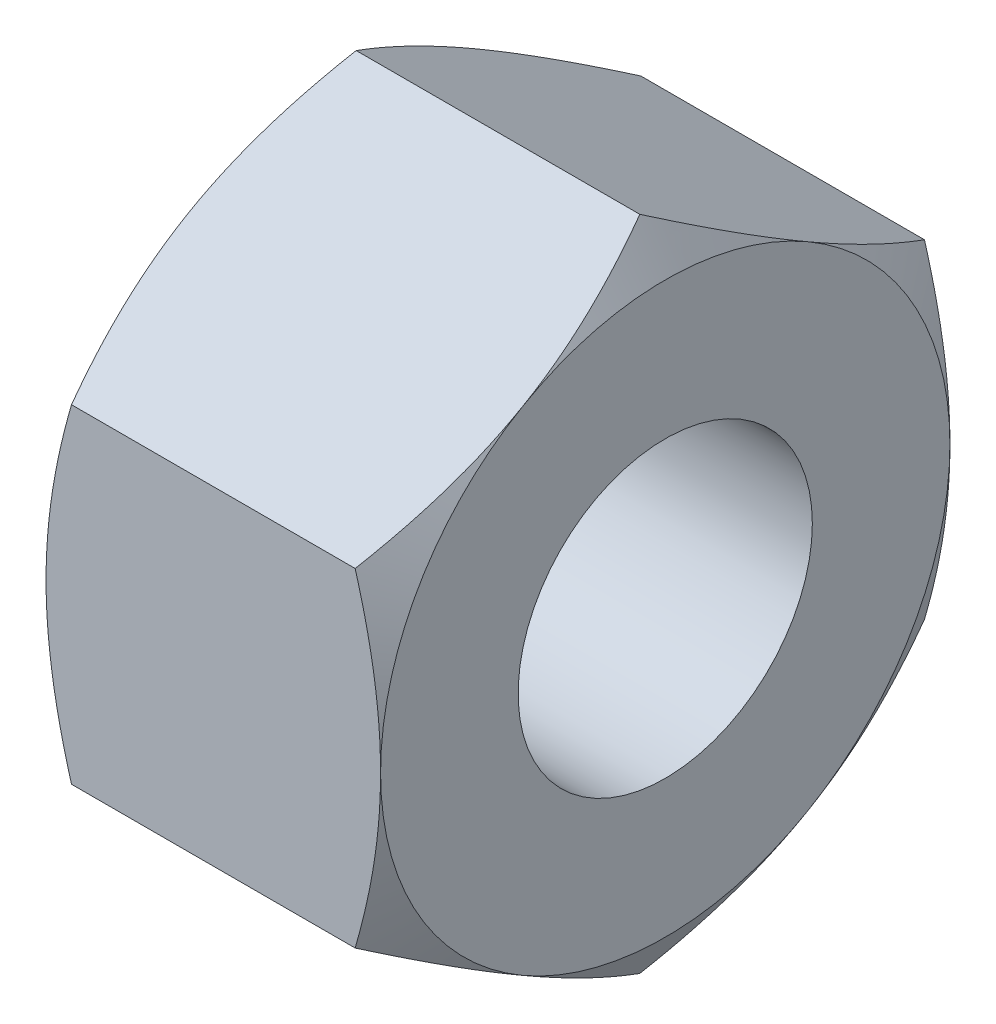
ISO-10303-21;
HEADER;
FILE_DESCRIPTION(('STEP AP214'),'2;1');
FILE_NAME('part.step','',(''),(''),'','','');
FILE_SCHEMA(('AUTOMOTIVE_DESIGN { 1 0 10303 214 1 1 1 1 }'));
ENDSEC;
DATA;
#1=APPLICATION_CONTEXT('core data for automotive mechanical design processes');
#2=APPLICATION_PROTOCOL_DEFINITION('international standard','automotive_design',2000,#1);
#3=PRODUCT_CONTEXT('',#1,'mechanical');
#4=PRODUCT('Part','Part','',(#3));
#5=PRODUCT_RELATED_PRODUCT_CATEGORY('part','',(#4));
#6=PRODUCT_DEFINITION_FORMATION('','',#4);
#7=PRODUCT_DEFINITION_CONTEXT('part definition',#1,'design');
#8=PRODUCT_DEFINITION('design','',#6,#7);
#9=PRODUCT_DEFINITION_SHAPE('','',#8);
#10=(LENGTH_UNIT() NAMED_UNIT(*) SI_UNIT(.MILLI.,.METRE.));
#11=(NAMED_UNIT(*) PLANE_ANGLE_UNIT() SI_UNIT($,.RADIAN.));
#12=(NAMED_UNIT(*) SI_UNIT($,.STERADIAN.) SOLID_ANGLE_UNIT());
#13=UNCERTAINTY_MEASURE_WITH_UNIT(LENGTH_MEASURE(1.E-05),#10,'distance_accuracy_value','');
#14=(GEOMETRIC_REPRESENTATION_CONTEXT(3) GLOBAL_UNCERTAINTY_ASSIGNED_CONTEXT((#13)) GLOBAL_UNIT_ASSIGNED_CONTEXT((#10,
#11,#12)) REPRESENTATION_CONTEXT('',''));
#15=CARTESIAN_POINT('',(0.,0.,0.));
#16=DIRECTION('',(0.,0.,1.));
#17=DIRECTION('',(1.,0.,0.));
#18=AXIS2_PLACEMENT_3D('',#15,#16,#17);
#19=CARTESIAN_POINT('',(-4.7,2.30940107675851,-4.));
#20=DIRECTION('',(0.,0.866025403784439,-0.5));
#21=DIRECTION('',(0.,0.5,0.866025403784439));
#22=AXIS2_PLACEMENT_3D('',#19,#20,#21);
#23=PLANE('',#22);
#24=DIRECTION('',(1.,0.,0.));
#25=VECTOR('',#24,1.);
#26=CARTESIAN_POINT('',(-4.7,2.30940107675851,-4.));
#27=LINE('',#26,#25);
#28=CARTESIAN_POINT('',(-4.34273441009184,2.30940107675851,-4.));
#29=VERTEX_POINT('',#28);
#30=CARTESIAN_POINT('',(-0.357265589908162,2.30940107675851,-4.));
#31=VERTEX_POINT('',#30);
#32=EDGE_CURVE('E246',#29,#31,#27,.T.);
#33=ORIENTED_EDGE('',*,*,#32,.F.);
#34=CARTESIAN_POINT('',(-4.34266774092523,2.30928560670467,-4.0002));
#35=CARTESIAN_POINT('',(-4.40128212635172,2.41077174646171,-3.82442084967677));
#36=CARTESIAN_POINT('',(-4.45458967853774,2.513133908835,-3.64712438367362));
#37=CARTESIAN_POINT('',(-4.5476383292536,2.71963072479812,-3.28946140682429));
#38=CARTESIAN_POINT('',(-4.5873465109703,2.82376904741904,-3.10908854102985));
#39=CARTESIAN_POINT('',(-4.64915778471972,3.03075510011795,-2.75057818129721));
#40=CARTESIAN_POINT('',(-4.67167226847711,3.13357098372492,-2.57249584706486));
#41=CARTESIAN_POINT('',(-4.69854937685342,3.33968651028529,-2.21549328283349));
#42=CARTESIAN_POINT('',(-4.70293425857306,3.44298540411434,-2.0365743503559));
#43=CARTESIAN_POINT('',(-4.69380992706003,3.63600352522933,-1.70225715780327));
#44=CARTESIAN_POINT('',(-4.68254104601201,3.72575165335065,-1.54680884001293));
#45=CARTESIAN_POINT('',(-4.64682600920181,3.90466320392055,-1.23692494436494));
#46=CARTESIAN_POINT('',(-4.62236765428847,3.99382600759479,-1.08249043825587));
#47=CARTESIAN_POINT('',(-4.56122393508071,4.17310641015197,-0.771967672225421));
#48=CARTESIAN_POINT('',(-4.52427939634514,4.26320131938131,-0.615918711936898));
#49=CARTESIAN_POINT('',(-4.44042992745197,4.44204742827551,-0.306148164596161));
#50=CARTESIAN_POINT('',(-4.39354469778726,4.53080091904966,-0.152422609226222));
#51=CARTESIAN_POINT('',(-4.34266774092523,4.61891762357085,0.0001999999999992));
#52=B_SPLINE_CURVE_WITH_KNOTS('',3,(#34,#35,#36,#37,#38,#39,#40,#41,#42,#43,#44,#45,#46,#47,#48,
#49,#50,#51),.UNSPECIFIED.,.F.,.F.,(4,2,2,2,2,2,2,2,4),(0.,0.634047835695966,1.26961969224543,
1.88946157213122,2.50854226669297,3.04757825393386,3.58711366126903,4.13861653143764,
4.68903648037743),.UNSPECIFIED.);
#53=CARTESIAN_POINT('',(-4.7,3.46410161513775,-2.));
#54=VERTEX_POINT('',#53);
#55=EDGE_CURVE('E133',#29,#54,#52,.T.);
#56=ORIENTED_EDGE('',*,*,#55,.T.);
#57=CARTESIAN_POINT('',(-4.34273441009184,4.61880215351701,0.));
#58=VERTEX_POINT('',#57);
#59=EDGE_CURVE('E54',#54,#58,#52,.T.);
#60=ORIENTED_EDGE('',*,*,#59,.T.);
#61=DIRECTION('',(1.,0.,0.));
#62=VECTOR('',#61,1.);
#63=CARTESIAN_POINT('',(-4.7,4.61880215351701,0.));
#64=LINE('',#63,#62);
#65=CARTESIAN_POINT('',(-0.357265589908163,4.61880215351701,0.));
#66=VERTEX_POINT('',#65);
#67=EDGE_CURVE('E286',#58,#66,#64,.T.);
#68=ORIENTED_EDGE('',*,*,#67,.T.);
#69=CARTESIAN_POINT('',(-0.357332259074767,4.61891762357085,0.000199999999999147));
#70=CARTESIAN_POINT('',(-0.298717873648283,4.51743148381381,-0.175579150323229));
#71=CARTESIAN_POINT('',(-0.245410321462263,4.41506932144052,-0.352875616326382));
#72=CARTESIAN_POINT('',(-0.152361670746404,4.2085725054774,-0.710538593175708));
#73=CARTESIAN_POINT('',(-0.112653489029704,4.10443418285647,-0.890911458970153));
#74=CARTESIAN_POINT('',(-0.0508422152802794,3.89744813015756,-1.24942181870279));
#75=CARTESIAN_POINT('',(-0.0283277315228897,3.79463224655059,-1.42750415293514));
#76=CARTESIAN_POINT('',(-0.00145062314658286,3.58851671999023,-1.78450671716651));
#77=CARTESIAN_POINT('',(0.00293425857305602,3.48521782616117,-1.9634256496441));
#78=CARTESIAN_POINT('',(-0.00619007293997078,3.29219970504619,-2.29774284219673));
#79=CARTESIAN_POINT('',(-0.0174589539879948,3.20245157692486,-2.45319115998707));
#80=CARTESIAN_POINT('',(-0.0531739907981936,3.02354002635497,-2.76307505563506));
#81=CARTESIAN_POINT('',(-0.0776323457115334,2.93437722268073,-2.91750956174413));
#82=CARTESIAN_POINT('',(-0.13877606491929,2.75509682012354,-3.22803232777458));
#83=CARTESIAN_POINT('',(-0.175720603654864,2.6650019108942,-3.3840812880631));
#84=CARTESIAN_POINT('',(-0.259570072548027,2.48615580200001,-3.69385183540384));
#85=CARTESIAN_POINT('',(-0.30645530221274,2.39740231122585,-3.84757739077378));
#86=CARTESIAN_POINT('',(-0.357332259074766,2.30928560670467,-4.0002));
#87=B_SPLINE_CURVE_WITH_KNOTS('',3,(#69,#70,#71,#72,#73,#74,#75,#76,#77,#78,#79,#80,#81,#82,#83,
#84,#85,#86),.UNSPECIFIED.,.F.,.F.,(4,2,2,2,2,2,2,2,4),(0.,0.634047835695967,1.26961969224543,
1.88946157213122,2.50854226669297,3.04757825393386,3.58711366126903,4.13861653143764,
4.68903648037743),.UNSPECIFIED.);
#88=CARTESIAN_POINT('',(0.,3.46410161513775,-2.));
#89=VERTEX_POINT('',#88);
#90=EDGE_CURVE('E280',#66,#89,#87,.T.);
#91=ORIENTED_EDGE('',*,*,#90,.T.);
#92=EDGE_CURVE('E263',#89,#31,#87,.T.);
#93=ORIENTED_EDGE('',*,*,#92,.T.);
#94=EDGE_LOOP('',(#33,#56,#60,#68,#91,#93));
#95=FACE_BOUND('',#94,.T.);
#96=ADVANCED_FACE('F38',(#95),#23,.T.);
#97=CARTESIAN_POINT('',(-4.7,-2.3094010767585,-4.));
#98=DIRECTION('',(0.,0.,-1.));
#99=DIRECTION('',(0.,1.,0.));
#100=AXIS2_PLACEMENT_3D('',#97,#98,#99);
#101=PLANE('',#100);
#102=DIRECTION('',(1.,0.,0.));
#103=VECTOR('',#102,1.);
#104=CARTESIAN_POINT('',(-4.7,-2.3094010767585,-4.));
#105=LINE('',#104,#103);
#106=CARTESIAN_POINT('',(-4.34273441009218,-2.30940107675901,-4.));
#107=VERTEX_POINT('',#106);
#108=CARTESIAN_POINT('',(-0.357265589908161,-2.3094010767585,-4.));
#109=VERTEX_POINT('',#108);
#110=EDGE_CURVE('E156',#107,#109,#105,.T.);
#111=ORIENTED_EDGE('',*,*,#110,.F.);
#112=CARTESIAN_POINT('',(-2.73915863045049,-6.22132716152689,-4.));
#113=CARTESIAN_POINT('',(-2.82407869444724,-6.04641542373816,-4.));
#114=CARTESIAN_POINT('',(-2.90818948420925,-5.87110397724771,-4.));
#115=CARTESIAN_POINT('',(-3.07433753266989,-5.51946906682254,-4.));
#116=CARTESIAN_POINT('',(-3.15637446760444,-5.34314545007916,-4.));
#117=CARTESIAN_POINT('',(-3.31832839957268,-4.98837438666336,-4.));
#118=CARTESIAN_POINT('',(-3.39823158952975,-4.8099206153221,-4.));
#119=CARTESIAN_POINT('',(-3.55479030061934,-4.45159935662795,-4.));
#120=CARTESIAN_POINT('',(-3.63144597429627,-4.27173193614944,-4.));
#121=CARTESIAN_POINT('',(-3.78303146012376,-3.90453444048038,-4.));
#122=CARTESIAN_POINT('',(-3.85782841281087,-3.71714921964734,-4.));
#123=CARTESIAN_POINT('',(-4.00180480734034,-3.34019347088526,-4.));
#124=CARTESIAN_POINT('',(-4.07098362181684,-3.15062270159234,-4.));
#125=CARTESIAN_POINT('',(-4.2019217019232,-2.76934277374331,-4.));
#126=CARTESIAN_POINT('',(-4.26369580289476,-2.57763876126151,-4.));
#127=CARTESIAN_POINT('',(-4.37785463752177,-2.19148149002147,-4.));
#128=CARTESIAN_POINT('',(-4.43024230687129,-1.99702911144029,-4.));
#129=CARTESIAN_POINT('',(-4.52286111810192,-1.60629049106915,-4.));
#130=CARTESIAN_POINT('',(-4.56315543496638,-1.4100195038382,-4.));
#131=CARTESIAN_POINT('',(-4.62930192517458,-1.01501909881062,-4.));
#132=CARTESIAN_POINT('',(-4.65515559787334,-0.816289938434088,-4.));
#133=CARTESIAN_POINT('',(-4.69002100351423,-0.419968695234661,-4.));
#134=CARTESIAN_POINT('',(-4.6992507176889,-0.222396273414835,-4.));
#135=CARTESIAN_POINT('',(-4.70066062847961,0.172829461800663,-4.));
#136=CARTESIAN_POINT('',(-4.69284025952553,0.370482777662239,-4.));
#137=CARTESIAN_POINT('',(-4.66569636322258,0.70541478498775,-4.));
#138=CARTESIAN_POINT('',(-4.65051836595668,0.843050263183906,-4.));
#139=CARTESIAN_POINT('',(-4.61282894036615,1.11732021410052,-4.));
#140=CARTESIAN_POINT('',(-4.59031653685117,1.25395455123668,-4.));
#141=CARTESIAN_POINT('',(-4.51296058250708,1.66216198609891,-4.));
#142=CARTESIAN_POINT('',(-4.44831129025739,1.93189792671802,-4.));
#143=CARTESIAN_POINT('',(-4.33608220076587,2.33543320874441,-4.));
#144=CARTESIAN_POINT('',(-4.29557395059739,2.47131806818041,-4.));
#145=CARTESIAN_POINT('',(-4.21032649798689,2.74176697093589,-4.));
#146=CARTESIAN_POINT('',(-4.16558726258139,2.87633100395582,-4.));
#147=CARTESIAN_POINT('',(-4.07259800862474,3.14418347720911,-4.));
#148=CARTESIAN_POINT('',(-4.02434906139688,3.27747229275664,-4.));
#149=CARTESIAN_POINT('',(-3.92491058648101,3.5429410881137,-4.));
#150=CARTESIAN_POINT('',(-3.87372113274675,3.67512109571401,-4.));
#151=CARTESIAN_POINT('',(-3.72741421163013,4.0427234445139,-4.));
#152=CARTESIAN_POINT('',(-3.62959181696772,4.2770683463778,-4.));
#153=CARTESIAN_POINT('',(-3.42820446961943,4.74328685880477,-4.));
#154=CARTESIAN_POINT('',(-3.32463882846853,4.97516016909945,-4.));
#155=CARTESIAN_POINT('',(-3.11318693896516,5.43702542726727,-4.));
#156=CARTESIAN_POINT('',(-3.00529910629108,5.66701664735327,-4.));
#157=CARTESIAN_POINT('',(-2.78626785251234,6.12544691404603,-4.));
#158=CARTESIAN_POINT('',(-2.67512433004424,6.35388591205216,-4.));
#159=CARTESIAN_POINT('',(-2.450141003137,6.80988982111528,-4.));
#160=CARTESIAN_POINT('',(-2.33629712355105,7.03745271742713,-4.));
#161=CARTESIAN_POINT('',(-2.10662168894734,7.49157427276128,-4.));
#162=CARTESIAN_POINT('',(-1.99079011356382,7.71813292146417,-4.));
#163=CARTESIAN_POINT('',(-1.64099567781346,8.39648598463957,-4.));
#164=CARTESIAN_POINT('',(-1.40467904142165,8.84706603983213,-4.));
#165=CARTESIAN_POINT('',(-0.95435050163105,9.6961631137945,-4.));
#166=CARTESIAN_POINT('',(-0.740772146516694,10.0949111644426,-4.));
#167=CARTESIAN_POINT('',(-0.311217876317071,10.8911473149616,-4.));
#168=CARTESIAN_POINT('',(-0.0952418032307603,11.2886353295552,-4.));
#169=CARTESIAN_POINT('',(0.33774206113754,12.081307745496,-4.));
#170=CARTESIAN_POINT('',(0.554743915461465,12.4764953946908,-4.));
#171=CARTESIAN_POINT('',(0.990092758279137,13.2660872399658,-4.));
#172=CARTESIAN_POINT('',(1.20843963535228,13.6604914974551,-4.));
#173=CARTESIAN_POINT('',(1.42727373609433,14.0546236411182,-4.));
#174=B_SPLINE_CURVE_WITH_KNOTS('',3,(#112,#113,#114,#115,#116,#117,#118,#119,#120,#121,#122,
#123,#124,#125,#126,#127,#128,#129,#130,#131,#132,#133,#134,#135,#136,#137,#138,#139,#140,#141,
#142,#143,#144,#145,#146,#147,#148,#149,#150,#151,#152,#153,#154,#155,#156,#157,#158,#159,#160,
#161,#162,#163,#164,#165,#166,#167,#168,#169,#170,#171,#172,#173),.UNSPECIFIED.,.F.,.F.,(4,2,2,
2,2,2,2,2,2,2,2,2,2,2,2,2,2,2,2,2,2,2,2,2,2,2,2,2,2,2,4),(0.,0.583316402201073,1.16672331457054,
1.75327425928516,2.339797621538,2.94501324618584,3.55029636134527,4.15434577116168,
4.75820592785059,5.35885433180966,5.95944035955677,6.55209224520149,7.14476379006392,
7.55997249303662,7.97523642514039,8.80618888285302,9.23153510762542,9.65688464653201,
10.0821048899298,10.5073144437144,11.269023756193,12.0308245759055,12.7929072394975,
13.5550136552262,14.3183543098606,15.0817027902965,16.608036050675,17.9650619668228,
19.3221778432738,20.6747162851467,22.0271441514723),.UNSPECIFIED.);
#175=CARTESIAN_POINT('',(-4.7,0.,-4.));
#176=VERTEX_POINT('',#175);
#177=EDGE_CURVE('E137',#107,#176,#174,.T.);
#178=ORIENTED_EDGE('',*,*,#177,.T.);
#179=EDGE_CURVE('E127',#176,#29,#174,.T.);
#180=ORIENTED_EDGE('',*,*,#179,.T.);
#181=ORIENTED_EDGE('',*,*,#32,.T.);
#182=CARTESIAN_POINT('',(-1.96084136954951,-6.22132716152689,-4.));
#183=CARTESIAN_POINT('',(-1.87592130555276,-6.04641542373816,-4.));
#184=CARTESIAN_POINT('',(-1.79181051579075,-5.87110397724771,-4.));
#185=CARTESIAN_POINT('',(-1.62566246733011,-5.51946906682254,-4.));
#186=CARTESIAN_POINT('',(-1.54362553239556,-5.34314545007916,-4.));
#187=CARTESIAN_POINT('',(-1.38167160042732,-4.98837438666336,-4.));
#188=CARTESIAN_POINT('',(-1.30176841047025,-4.8099206153221,-4.));
#189=CARTESIAN_POINT('',(-1.14520969938066,-4.45159935662795,-4.));
#190=CARTESIAN_POINT('',(-1.06855402570373,-4.27173193614944,-4.));
#191=CARTESIAN_POINT('',(-0.916968539876236,-3.90453444048038,-4.));
#192=CARTESIAN_POINT('',(-0.842171587189126,-3.71714921964734,-4.));
#193=CARTESIAN_POINT('',(-0.698195192659659,-3.34019347088526,-4.));
#194=CARTESIAN_POINT('',(-0.629016378183156,-3.15062270159234,-4.));
#195=CARTESIAN_POINT('',(-0.498078298076798,-2.76934277374331,-4.));
#196=CARTESIAN_POINT('',(-0.436304197105237,-2.57763876126151,-4.));
#197=CARTESIAN_POINT('',(-0.322145362478228,-2.19148149002147,-4.));
#198=CARTESIAN_POINT('',(-0.269757693128707,-1.99702911144029,-4.));
#199=CARTESIAN_POINT('',(-0.177138881898076,-1.60629049106915,-4.));
#200=CARTESIAN_POINT('',(-0.136844565033622,-1.4100195038382,-4.));
#201=CARTESIAN_POINT('',(-0.0706980748254177,-1.01501909881062,-4.));
#202=CARTESIAN_POINT('',(-0.0448444021266584,-0.816289938434088,-4.));
#203=CARTESIAN_POINT('',(-0.00997899648577519,-0.419968695234661,-4.));
#204=CARTESIAN_POINT('',(-0.000749282311100673,-0.222396273414835,-4.));
#205=CARTESIAN_POINT('',(0.000660628479610507,0.172829461800663,-4.));
#206=CARTESIAN_POINT('',(-0.00715974047447027,0.370482777662239,-4.));
#207=CARTESIAN_POINT('',(-0.0343036367774156,0.70541478498775,-4.));
#208=CARTESIAN_POINT('',(-0.0494816340433198,0.843050263183906,-4.));
#209=CARTESIAN_POINT('',(-0.0871710596338506,1.11732021410052,-4.));
#210=CARTESIAN_POINT('',(-0.109683463148833,1.25395455123668,-4.));
#211=CARTESIAN_POINT('',(-0.187039417492916,1.66216198609891,-4.));
#212=CARTESIAN_POINT('',(-0.251688709742608,1.93189792671802,-4.));
#213=CARTESIAN_POINT('',(-0.363917799234133,2.33543320874441,-4.));
#214=CARTESIAN_POINT('',(-0.404426049402612,2.47131806818041,-4.));
#215=CARTESIAN_POINT('',(-0.489673502013107,2.74176697093589,-4.));
#216=CARTESIAN_POINT('',(-0.534412737418615,2.87633100395582,-4.));
#217=CARTESIAN_POINT('',(-0.62740199137526,3.14418347720911,-4.));
#218=CARTESIAN_POINT('',(-0.675650938603124,3.27747229275664,-4.));
#219=CARTESIAN_POINT('',(-0.775089413518995,3.5429410881137,-4.));
#220=CARTESIAN_POINT('',(-0.826278867253247,3.67512109571401,-4.));
#221=CARTESIAN_POINT('',(-0.972585788369865,4.0427234445139,-4.));
#222=CARTESIAN_POINT('',(-1.07040818303228,4.2770683463778,-4.));
#223=CARTESIAN_POINT('',(-1.27179553038057,4.74328685880477,-4.));
#224=CARTESIAN_POINT('',(-1.37536117153147,4.97516016909945,-4.));
#225=CARTESIAN_POINT('',(-1.58681306103484,5.43702542726727,-4.));
#226=CARTESIAN_POINT('',(-1.69470089370892,5.66701664735327,-4.));
#227=CARTESIAN_POINT('',(-1.91373214748766,6.12544691404603,-4.));
#228=CARTESIAN_POINT('',(-2.02487566995576,6.35388591205216,-4.));
#229=CARTESIAN_POINT('',(-2.249858996863,6.80988982111528,-4.));
#230=CARTESIAN_POINT('',(-2.36370287644895,7.03745271742713,-4.));
#231=CARTESIAN_POINT('',(-2.59337831105266,7.49157427276128,-4.));
#232=CARTESIAN_POINT('',(-2.70920988643618,7.71813292146417,-4.));
#233=CARTESIAN_POINT('',(-3.05900432218654,8.39648598463957,-4.));
#234=CARTESIAN_POINT('',(-3.29532095857835,8.84706603983213,-4.));
#235=CARTESIAN_POINT('',(-3.74564949836895,9.6961631137945,-4.));
#236=CARTESIAN_POINT('',(-3.9592278534833,10.0949111644426,-4.));
#237=CARTESIAN_POINT('',(-4.38878212368293,10.8911473149616,-4.));
#238=CARTESIAN_POINT('',(-4.60475819676924,11.2886353295552,-4.));
#239=CARTESIAN_POINT('',(-5.03774206113754,12.081307745496,-4.));
#240=CARTESIAN_POINT('',(-5.25474391546147,12.4764953946908,-4.));
#241=CARTESIAN_POINT('',(-5.69009275827914,13.2660872399658,-4.));
#242=CARTESIAN_POINT('',(-5.90843963535228,13.6604914974551,-4.));
#243=CARTESIAN_POINT('',(-6.12727373609433,14.0546236411182,-4.));
#244=B_SPLINE_CURVE_WITH_KNOTS('',3,(#182,#183,#184,#185,#186,#187,#188,#189,#190,#191,#192,
#193,#194,#195,#196,#197,#198,#199,#200,#201,#202,#203,#204,#205,#206,#207,#208,#209,#210,#211,
#212,#213,#214,#215,#216,#217,#218,#219,#220,#221,#222,#223,#224,#225,#226,#227,#228,#229,#230,
#231,#232,#233,#234,#235,#236,#237,#238,#239,#240,#241,#242,#243),.UNSPECIFIED.,.F.,.F.,(4,2,2,
2,2,2,2,2,2,2,2,2,2,2,2,2,2,2,2,2,2,2,2,2,2,2,2,2,2,2,4),(0.,0.583316402201073,1.16672331457054,
1.75327425928516,2.339797621538,2.94501324618584,3.55029636134527,4.15434577116168,
4.75820592785059,5.35885433180966,5.95944035955677,6.55209224520149,7.14476379006392,
7.55997249303662,7.97523642514039,8.80618888285302,9.23153510762543,9.656884646532,
10.0821048899298,10.5073144437144,11.269023756193,12.0308245759054,12.7929072394975,
13.5550136552262,14.3183543098606,15.0817027902965,16.608036050675,17.9650619668228,
19.3221778432738,20.6747162851467,22.0271441514723),.UNSPECIFIED.);
#245=CARTESIAN_POINT('',(0.,0.,-4.));
#246=VERTEX_POINT('',#245);
#247=EDGE_CURVE('E261',#31,#246,#244,.F.);
#248=ORIENTED_EDGE('',*,*,#247,.T.);
#249=EDGE_CURVE('E253',#246,#109,#244,.F.);
#250=ORIENTED_EDGE('',*,*,#249,.T.);
#251=EDGE_LOOP('',(#111,#178,#180,#181,#248,#250));
#252=FACE_BOUND('',#251,.T.);
#253=ADVANCED_FACE('F154',(#252),#101,.T.);
#254=CARTESIAN_POINT('',(-4.7,-4.618802153517,0.));
#255=DIRECTION('',(0.,-0.866025403784439,-0.5));
#256=DIRECTION('',(0.,0.5,-0.866025403784439));
#257=AXIS2_PLACEMENT_3D('',#254,#255,#256);
#258=PLANE('',#257);
#259=DIRECTION('',(1.,0.,0.));
#260=VECTOR('',#259,1.);
#261=CARTESIAN_POINT('',(-4.7,-4.618802153517,0.));
#262=LINE('',#261,#260);
#263=CARTESIAN_POINT('',(-4.34273441009184,-4.618802153517,0.));
#264=VERTEX_POINT('',#263);
#265=CARTESIAN_POINT('',(-0.357265589908161,-4.618802153517,0.));
#266=VERTEX_POINT('',#265);
#267=EDGE_CURVE('E247',#264,#266,#262,.T.);
#268=ORIENTED_EDGE('',*,*,#267,.F.);
#269=CARTESIAN_POINT('',(-4.34266774092523,-4.61891762357084,0.000200000000000067));
#270=CARTESIAN_POINT('',(-4.40128212635172,-4.5174314838138,-0.175579150323228));
#271=CARTESIAN_POINT('',(-4.45458967853774,-4.41506932144051,-0.352875616326381));
#272=CARTESIAN_POINT('',(-4.5476383292536,-4.20857250547739,-0.710538593175706));
#273=CARTESIAN_POINT('',(-4.5873465109703,-4.10443418285647,-0.89091145897015));
#274=CARTESIAN_POINT('',(-4.64915778471972,-3.89744813015756,-1.24942181870279));
#275=CARTESIAN_POINT('',(-4.67167226847711,-3.79463224655059,-1.42750415293514));
#276=CARTESIAN_POINT('',(-4.69854937685342,-3.58851671999023,-1.78450671716651));
#277=CARTESIAN_POINT('',(-4.70293425857306,-3.48521782616117,-1.9634256496441));
#278=CARTESIAN_POINT('',(-4.69380992706003,-3.29219970504619,-2.29774284219673));
#279=CARTESIAN_POINT('',(-4.68254104601201,-3.20245157692486,-2.45319115998707));
#280=CARTESIAN_POINT('',(-4.64682600920181,-3.02354002635497,-2.76307505563505));
#281=CARTESIAN_POINT('',(-4.62236765428847,-2.93437722268072,-2.91750956174413));
#282=CARTESIAN_POINT('',(-4.56122393508071,-2.75509682012354,-3.22803232777458));
#283=CARTESIAN_POINT('',(-4.52427939634514,-2.6650019108942,-3.3840812880631));
#284=CARTESIAN_POINT('',(-4.44042992745197,-2.48615580200001,-3.69385183540384));
#285=CARTESIAN_POINT('',(-4.39354469778726,-2.39740231122585,-3.84757739077378));
#286=CARTESIAN_POINT('',(-4.34266774092523,-2.30928560670466,-4.0002));
#287=B_SPLINE_CURVE_WITH_KNOTS('',3,(#269,#270,#271,#272,#273,#274,#275,#276,#277,#278,#279,
#280,#281,#282,#283,#284,#285,#286),.UNSPECIFIED.,.F.,.F.,(4,2,2,2,2,2,2,2,4),(0.,
0.634047835695966,1.26961969224543,1.88946157213122,2.50854226669297,3.04757825393386,
3.58711366126903,4.13861653143764,4.68903648037743),.UNSPECIFIED.);
#288=CARTESIAN_POINT('',(-4.7,-3.46410161513776,-2.));
#289=VERTEX_POINT('',#288);
#290=EDGE_CURVE('E236',#264,#289,#287,.T.);
#291=ORIENTED_EDGE('',*,*,#290,.T.);
#292=EDGE_CURVE('E145',#289,#107,#287,.T.);
#293=ORIENTED_EDGE('',*,*,#292,.T.);
#294=ORIENTED_EDGE('',*,*,#110,.T.);
#295=CARTESIAN_POINT('',(-0.357332259074766,-2.30928560670466,-4.0002));
#296=CARTESIAN_POINT('',(-0.298717873648281,-2.4107717464617,-3.82442084967677));
#297=CARTESIAN_POINT('',(-0.245410321462262,-2.51313390883499,-3.64712438367362));
#298=CARTESIAN_POINT('',(-0.152361670746402,-2.71963072479811,-3.28946140682429));
#299=CARTESIAN_POINT('',(-0.112653489029703,-2.82376904741904,-3.10908854102985));
#300=CARTESIAN_POINT('',(-0.050842215280278,-3.03075510011795,-2.75057818129721));
#301=CARTESIAN_POINT('',(-0.0283277315228877,-3.13357098372492,-2.57249584706486));
#302=CARTESIAN_POINT('',(-0.00145062314658059,-3.33968651028528,-2.21549328283349));
#303=CARTESIAN_POINT('',(0.00293425857305798,-3.44298540411434,-2.0365743503559));
#304=CARTESIAN_POINT('',(-0.00619007293996898,-3.63600352522932,-1.70225715780327));
#305=CARTESIAN_POINT('',(-0.0174589539879929,-3.72575165335064,-1.54680884001293));
#306=CARTESIAN_POINT('',(-0.0531739907981916,-3.90466320392054,-1.23692494436494));
#307=CARTESIAN_POINT('',(-0.0776323457115314,-3.99382600759478,-1.08249043825587));
#308=CARTESIAN_POINT('',(-0.138776064919288,-4.17310641015197,-0.771967672225422));
#309=CARTESIAN_POINT('',(-0.175720603654862,-4.26320131938131,-0.615918711936898));
#310=CARTESIAN_POINT('',(-0.259570072548025,-4.4420474282755,-0.306148164596161));
#311=CARTESIAN_POINT('',(-0.306455302212738,-4.53080091904966,-0.152422609226221));
#312=CARTESIAN_POINT('',(-0.357332259074765,-4.61891762357084,0.000200000000000173));
#313=B_SPLINE_CURVE_WITH_KNOTS('',3,(#295,#296,#297,#298,#299,#300,#301,#302,#303,#304,#305,
#306,#307,#308,#309,#310,#311,#312),.UNSPECIFIED.,.F.,.F.,(4,2,2,2,2,2,2,2,4),(0.,
0.634047835695966,1.26961969224543,1.88946157213122,2.50854226669297,3.04757825393386,
3.58711366126903,4.13861653143764,4.68903648037743),.UNSPECIFIED.);
#314=CARTESIAN_POINT('',(0.,-3.46410161513776,-2.));
#315=VERTEX_POINT('',#314);
#316=EDGE_CURVE('E245',#109,#315,#313,.T.);
#317=ORIENTED_EDGE('',*,*,#316,.T.);
#318=EDGE_CURVE('E257',#315,#266,#313,.T.);
#319=ORIENTED_EDGE('',*,*,#318,.T.);
#320=EDGE_LOOP('',(#268,#291,#293,#294,#317,#319));
#321=FACE_BOUND('',#320,.T.);
#322=ADVANCED_FACE('F241',(#321),#258,.T.);
#323=CARTESIAN_POINT('',(-4.7,-2.3094010767585,4.));
#324=DIRECTION('',(0.,-0.866025403784439,0.5));
#325=DIRECTION('',(0.,-0.5,-0.866025403784439));
#326=AXIS2_PLACEMENT_3D('',#323,#324,#325);
#327=PLANE('',#326);
#328=DIRECTION('',(1.,0.,0.));
#329=VECTOR('',#328,1.);
#330=CARTESIAN_POINT('',(-4.7,-2.3094010767585,4.));
#331=LINE('',#330,#329);
#332=CARTESIAN_POINT('',(-4.34273441009218,-2.30940107675901,4.));
#333=VERTEX_POINT('',#332);
#334=CARTESIAN_POINT('',(-0.357265589907823,-2.30940107675901,4.));
#335=VERTEX_POINT('',#334);
#336=EDGE_CURVE('E230',#333,#335,#331,.T.);
#337=ORIENTED_EDGE('',*,*,#336,.F.);
#338=CARTESIAN_POINT('',(-4.34266774092523,-2.30928560670466,4.0002));
#339=CARTESIAN_POINT('',(-4.40128212635172,-2.4107717464617,3.82442084967677));
#340=CARTESIAN_POINT('',(-4.45458967853774,-2.51313390883499,3.64712438367362));
#341=CARTESIAN_POINT('',(-4.5476383292536,-2.71963072479811,3.28946140682429));
#342=CARTESIAN_POINT('',(-4.5873465109703,-2.82376904741904,3.10908854102985));
#343=CARTESIAN_POINT('',(-4.64915778471972,-3.03075510011795,2.75057818129721));
#344=CARTESIAN_POINT('',(-4.67167226847711,-3.13357098372491,2.57249584706486));
#345=CARTESIAN_POINT('',(-4.69854937685342,-3.33968651028528,2.21549328283349));
#346=CARTESIAN_POINT('',(-4.70293425857306,-3.44298540411434,2.0365743503559));
#347=CARTESIAN_POINT('',(-4.69380992706003,-3.63600352522932,1.70225715780327));
#348=CARTESIAN_POINT('',(-4.68254104601201,-3.72575165335064,1.54680884001293));
#349=CARTESIAN_POINT('',(-4.64682600920181,-3.90466320392054,1.23692494436494));
#350=CARTESIAN_POINT('',(-4.62236765428847,-3.99382600759478,1.08249043825587));
#351=CARTESIAN_POINT('',(-4.56122393508071,-4.17310641015197,0.771967672225422));
#352=CARTESIAN_POINT('',(-4.52427939634514,-4.26320131938131,0.615918711936898));
#353=CARTESIAN_POINT('',(-4.44042992745197,-4.4420474282755,0.30614816459616));
#354=CARTESIAN_POINT('',(-4.39354469778726,-4.53080091904966,0.152422609226221));
#355=CARTESIAN_POINT('',(-4.34266774092523,-4.61891762357084,-0.000200000000000204));
#356=B_SPLINE_CURVE_WITH_KNOTS('',3,(#338,#339,#340,#341,#342,#343,#344,#345,#346,#347,#348,
#349,#350,#351,#352,#353,#354,#355),.UNSPECIFIED.,.F.,.F.,(4,2,2,2,2,2,2,2,4),(0.,
0.634047835695966,1.26961969224543,1.88946157213122,2.50854226669297,3.04757825393386,
3.58711366126903,4.13861653143764,4.68903648037743),.UNSPECIFIED.);
#357=CARTESIAN_POINT('',(-4.7,-3.46410161513775,2.));
#358=VERTEX_POINT('',#357);
#359=EDGE_CURVE('E138',#333,#358,#356,.T.);
#360=ORIENTED_EDGE('',*,*,#359,.T.);
#361=EDGE_CURVE('E157',#358,#264,#356,.T.);
#362=ORIENTED_EDGE('',*,*,#361,.T.);
#363=ORIENTED_EDGE('',*,*,#267,.T.);
#364=CARTESIAN_POINT('',(-0.357332259074765,-4.61891762357084,-0.000200000000000029));
#365=CARTESIAN_POINT('',(-0.298717873648281,-4.5174314838138,0.175579150323228));
#366=CARTESIAN_POINT('',(-0.245410321462261,-4.41506932144051,0.352875616326381));
#367=CARTESIAN_POINT('',(-0.152361670746402,-4.20857250547739,0.710538593175706));
#368=CARTESIAN_POINT('',(-0.112653489029703,-4.10443418285647,0.890911458970151));
#369=CARTESIAN_POINT('',(-0.0508422152802774,-3.89744813015756,1.24942181870279));
#370=CARTESIAN_POINT('',(-0.0283277315228872,-3.79463224655059,1.42750415293514));
#371=CARTESIAN_POINT('',(-0.00145062314658039,-3.58851671999023,1.78450671716651));
#372=CARTESIAN_POINT('',(0.00293425857305799,-3.48521782616117,1.9634256496441));
#373=CARTESIAN_POINT('',(-0.00619007293996899,-3.29219970504619,2.29774284219673));
#374=CARTESIAN_POINT('',(-0.0174589539879928,-3.20245157692486,2.45319115998707));
#375=CARTESIAN_POINT('',(-0.0531739907981916,-3.02354002635496,2.76307505563505));
#376=CARTESIAN_POINT('',(-0.0776323457115315,-2.93437722268072,2.91750956174413));
#377=CARTESIAN_POINT('',(-0.138776064919288,-2.75509682012354,3.22803232777458));
#378=CARTESIAN_POINT('',(-0.175720603654862,-2.6650019108942,3.3840812880631));
#379=CARTESIAN_POINT('',(-0.259570072548025,-2.486155802,3.69385183540384));
#380=CARTESIAN_POINT('',(-0.306455302212738,-2.39740231122584,3.84757739077378));
#381=CARTESIAN_POINT('',(-0.357332259074765,-2.30928560670466,4.0002));
#382=B_SPLINE_CURVE_WITH_KNOTS('',3,(#364,#365,#366,#367,#368,#369,#370,#371,#372,#373,#374,
#375,#376,#377,#378,#379,#380,#381),.UNSPECIFIED.,.F.,.F.,(4,2,2,2,2,2,2,2,4),(0.,
0.634047835695966,1.26961969224543,1.88946157213122,2.50854226669297,3.04757825393386,
3.58711366126903,4.13861653143764,4.68903648037743),.UNSPECIFIED.);
#383=CARTESIAN_POINT('',(0.,-3.46410161513775,2.));
#384=VERTEX_POINT('',#383);
#385=EDGE_CURVE('E305',#266,#384,#382,.T.);
#386=ORIENTED_EDGE('',*,*,#385,.T.);
#387=EDGE_CURVE('E306',#384,#335,#382,.T.);
#388=ORIENTED_EDGE('',*,*,#387,.T.);
#389=EDGE_LOOP('',(#337,#360,#362,#363,#386,#388));
#390=FACE_BOUND('',#389,.T.);
#391=ADVANCED_FACE('F227',(#390),#327,.T.);
#392=CARTESIAN_POINT('',(-4.7,2.30940107675851,4.));
#393=DIRECTION('',(0.,0.,1.));
#394=DIRECTION('',(1.,0.,0.));
#395=AXIS2_PLACEMENT_3D('',#392,#393,#394);
#396=PLANE('',#395);
#397=DIRECTION('',(1.,0.,0.));
#398=VECTOR('',#397,1.);
#399=CARTESIAN_POINT('',(-4.7,2.30940107675851,4.));
#400=LINE('',#399,#398);
#401=CARTESIAN_POINT('',(-4.34273441009184,2.30940107675851,4.));
#402=VERTEX_POINT('',#401);
#403=CARTESIAN_POINT('',(-0.357265589908162,2.30940107675851,4.));
#404=VERTEX_POINT('',#403);
#405=EDGE_CURVE('E284',#402,#404,#400,.T.);
#406=ORIENTED_EDGE('',*,*,#405,.F.);
#407=CARTESIAN_POINT('',(-2.73915863059902,-6.22132716122105,4.));
#408=CARTESIAN_POINT('',(-2.82407869458955,-6.04641542344261,4.));
#409=CARTESIAN_POINT('',(-2.90818948434535,-5.87110397696246,4.));
#410=CARTESIAN_POINT('',(-3.07433753279359,-5.51946906655792,4.));
#411=CARTESIAN_POINT('',(-3.15637446772196,-5.34314544982487,4.));
#412=CARTESIAN_POINT('',(-3.31832839967782,-4.9883743864299,4.));
#413=CARTESIAN_POINT('',(-3.39823158962871,-4.80992061509913,4.));
#414=CARTESIAN_POINT('',(-3.55479030070603,-4.45159935642604,4.));
#415=CARTESIAN_POINT('',(-3.63144597437686,-4.2717319359581,4.));
#416=CARTESIAN_POINT('',(-3.78303146019205,-3.90453444031094,4.));
#417=CARTESIAN_POINT('',(-3.85782841287294,-3.71714921948923,4.));
#418=CARTESIAN_POINT('',(-4.00180480739032,-3.34019347075001,4.));
#419=CARTESIAN_POINT('',(-4.07098362186094,-3.15062270146861,4.));
#420=CARTESIAN_POINT('',(-4.20192170195611,-2.76934277364283,4.));
#421=CARTESIAN_POINT('',(-4.26369580292235,-2.57763876117277,4.));
#422=CARTESIAN_POINT('',(-4.37785463753962,-2.19148148995653,4.));
#423=CARTESIAN_POINT('',(-4.4302423068847,-1.9970291113874,4.));
#424=CARTESIAN_POINT('',(-4.52286111810639,-1.60629049104665,4.));
#425=CARTESIAN_POINT('',(-4.56315543496669,-1.41001950383412,4.));
#426=CARTESIAN_POINT('',(-4.62930192516939,-1.01501909884382,4.));
#427=CARTESIAN_POINT('',(-4.65515559786679,-0.816289938486138,4.));
#428=CARTESIAN_POINT('',(-4.6900210035083,-0.419968695324109,4.));
#429=CARTESIAN_POINT('',(-4.69925071768491,-0.222396273522822,4.));
#430=CARTESIAN_POINT('',(-4.7006606284827,0.17282946165589,4.));
#431=CARTESIAN_POINT('',(-4.69284025953376,0.370482777499219,4.));
#432=CARTESIAN_POINT('',(-4.66569636324117,0.705414784801689,4.));
#433=CARTESIAN_POINT('',(-4.65051836597938,0.843050262992845,4.));
#434=CARTESIAN_POINT('',(-4.6128289403973,1.11732021389967,4.));
#435=CARTESIAN_POINT('',(-4.59031653688666,1.25395455103106,4.));
#436=CARTESIAN_POINT('',(-4.51296058255568,1.66216198587919,4.));
#437=CARTESIAN_POINT('',(-4.44831129031484,1.93189792648928,4.));
#438=CARTESIAN_POINT('',(-4.3360822008364,2.33543320850215,4.));
#439=CARTESIAN_POINT('',(-4.29557395067232,2.47131806793355,4.));
#440=CARTESIAN_POINT('',(-4.21032649807048,2.74176697067987,4.));
#441=CARTESIAN_POINT('',(-4.16558726266923,2.87633100369524,4.));
#442=CARTESIAN_POINT('',(-4.07259800872097,3.14418347693947,4.));
#443=CARTESIAN_POINT('',(-4.02434906149722,3.27747229248248,4.));
#444=CARTESIAN_POINT('',(-3.92491058658944,3.54294108783049,4.));
#445=CARTESIAN_POINT('',(-3.87372113285917,3.67512109542628,4.));
#446=CARTESIAN_POINT('',(-3.72741421174942,4.0427234442237,4.));
#447=CARTESIAN_POINT('',(-3.62959181708943,4.27706834608951,4.));
#448=CARTESIAN_POINT('',(-3.42820446974523,4.74328685852004,4.));
#449=CARTESIAN_POINT('',(-3.324638828596,4.97516016881639,4.));
#450=CARTESIAN_POINT('',(-3.11318693909543,5.43702542698734,4.));
#451=CARTESIAN_POINT('',(-3.0052991064225,5.66701664707482,4.));
#452=CARTESIAN_POINT('',(-2.78626785264566,6.12544691377038,4.));
#453=CARTESIAN_POINT('',(-2.67512433017833,6.35388591177784,4.));
#454=CARTESIAN_POINT('',(-2.45014100327232,6.80988982084357,4.));
#455=CARTESIAN_POINT('',(-2.33629712368682,7.03745271715671,4.));
#456=CARTESIAN_POINT('',(-2.10662168908384,7.49157427249335,4.));
#457=CARTESIAN_POINT('',(-1.99079011370057,7.71813292119744,4.));
#458=CARTESIAN_POINT('',(-1.6409956779508,8.39648598437629,4.));
#459=CARTESIAN_POINT('',(-1.4046790415591,8.84706603957101,4.));
#460=CARTESIAN_POINT('',(-0.95435050176942,9.69616311353533,4.));
#461=CARTESIAN_POINT('',(-0.740772146655935,10.0949111641833,4.));
#462=CARTESIAN_POINT('',(-0.311217876457894,10.8911473147019,4.));
#463=CARTESIAN_POINT('',(-0.0952418033722941,11.2886353292952,4.));
#464=CARTESIAN_POINT('',(0.33774206099453,12.0813077452351,4.));
#465=CARTESIAN_POINT('',(0.554743915317689,12.4764953944294,4.));
#466=CARTESIAN_POINT('',(0.990092758133896,13.2660872397031,4.));
#467=CARTESIAN_POINT('',(1.20843963520634,13.6604914971917,4.));
#468=CARTESIAN_POINT('',(1.42727373594772,14.0546236408541,4.));
#469=B_SPLINE_CURVE_WITH_KNOTS('',3,(#407,#408,#409,#410,#411,#412,#413,#414,#415,#416,#417,
#418,#419,#420,#421,#422,#423,#424,#425,#426,#427,#428,#429,#430,#431,#432,#433,#434,#435,#436,
#437,#438,#439,#440,#441,#442,#443,#444,#445,#446,#447,#448,#449,#450,#451,#452,#453,#454,#455,
#456,#457,#458,#459,#460,#461,#462,#463,#464,#465,#466,#467,#468),.UNSPECIFIED.,.F.,.F.,(4,2,2,
2,2,2,2,2,2,2,2,2,2,2,2,2,2,2,2,2,2,2,2,2,2,2,2,2,2,2,4),(0.,0.583316402165151,1.16672331449869,
1.75327425917699,2.33979762139351,2.94501324600286,3.55029636112378,4.15434577090182,
4.75820592755238,5.35885433145494,5.95944035914562,6.55209224473526,7.14476378954258,
7.55997249249902,7.97523642458653,8.80618888226657,9.23153510702197,9.65688464591155,
10.0821048892924,10.50731444306,11.2690237555411,12.030824575256,12.7929072388506,
13.5550136545819,14.3183543092192,15.0817027896578,16.6080360500419,17.9650619661881,
19.3221778426374,20.6747162845075,22.0271441508305),.UNSPECIFIED.);
#470=CARTESIAN_POINT('',(-4.7,0.,4.));
#471=VERTEX_POINT('',#470);
#472=EDGE_CURVE('E205',#402,#471,#469,.F.);
#473=ORIENTED_EDGE('',*,*,#472,.T.);
#474=EDGE_CURVE('E217',#471,#333,#469,.F.);
#475=ORIENTED_EDGE('',*,*,#474,.T.);
#476=ORIENTED_EDGE('',*,*,#336,.T.);
#477=CARTESIAN_POINT('',(-1.96084136940099,-6.22132716122105,4.));
#478=CARTESIAN_POINT('',(-1.87592130541045,-6.04641542344261,4.));
#479=CARTESIAN_POINT('',(-1.79181051565465,-5.87110397696246,4.));
#480=CARTESIAN_POINT('',(-1.62566246720641,-5.51946906655792,4.));
#481=CARTESIAN_POINT('',(-1.54362553227804,-5.34314544982487,4.));
#482=CARTESIAN_POINT('',(-1.38167160032218,-4.9883743864299,4.));
#483=CARTESIAN_POINT('',(-1.30176841037129,-4.80992061509913,4.));
#484=CARTESIAN_POINT('',(-1.14520969929397,-4.45159935642604,4.));
#485=CARTESIAN_POINT('',(-1.06855402562314,-4.2717319359581,4.));
#486=CARTESIAN_POINT('',(-0.916968539807949,-3.90453444031094,4.));
#487=CARTESIAN_POINT('',(-0.842171587127055,-3.71714921948923,4.));
#488=CARTESIAN_POINT('',(-0.698195192609684,-3.34019347075001,4.));
#489=CARTESIAN_POINT('',(-0.629016378139062,-3.15062270146861,4.));
#490=CARTESIAN_POINT('',(-0.498078298043895,-2.76934277364283,4.));
#491=CARTESIAN_POINT('',(-0.436304197077647,-2.57763876117277,4.));
#492=CARTESIAN_POINT('',(-0.322145362460385,-2.19148148995653,4.));
#493=CARTESIAN_POINT('',(-0.269757693115299,-1.9970291113874,4.));
#494=CARTESIAN_POINT('',(-0.177138881893608,-1.60629049104666,4.));
#495=CARTESIAN_POINT('',(-0.136844565033305,-1.41001950383412,4.));
#496=CARTESIAN_POINT('',(-0.0706980748306112,-1.01501909884382,4.));
#497=CARTESIAN_POINT('',(-0.0448444021332133,-0.81628993848614,4.));
#498=CARTESIAN_POINT('',(-0.00997899649169817,-0.41996869532411,4.));
#499=CARTESIAN_POINT('',(-0.000749282315090843,-0.222396273522823,4.));
#500=CARTESIAN_POINT('',(0.000660628482696814,0.17282946165589,4.));
#501=CARTESIAN_POINT('',(-0.0071597404662393,0.37048277749922,4.));
#502=CARTESIAN_POINT('',(-0.0343036367588334,0.70541478480169,4.));
#503=CARTESIAN_POINT('',(-0.0494816340206211,0.843050262992846,4.));
#504=CARTESIAN_POINT('',(-0.0871710596026982,1.11732021389967,4.));
#505=CARTESIAN_POINT('',(-0.109683463113343,1.25395455103106,4.));
#506=CARTESIAN_POINT('',(-0.187039417444321,1.66216198587919,4.));
#507=CARTESIAN_POINT('',(-0.251688709685157,1.93189792648927,4.));
#508=CARTESIAN_POINT('',(-0.363917799163599,2.33543320850215,4.));
#509=CARTESIAN_POINT('',(-0.404426049327685,2.47131806793355,4.));
#510=CARTESIAN_POINT('',(-0.489673501929522,2.74176697067987,4.));
#511=CARTESIAN_POINT('',(-0.534412737330767,2.87633100369524,4.));
#512=CARTESIAN_POINT('',(-0.627401991279032,3.14418347693946,4.));
#513=CARTESIAN_POINT('',(-0.675650938502781,3.27747229248247,4.));
#514=CARTESIAN_POINT('',(-0.77508941341056,3.54294108783049,4.));
#515=CARTESIAN_POINT('',(-0.826278867140834,3.67512109542628,4.));
#516=CARTESIAN_POINT('',(-0.972585788250576,4.0427234442237,4.));
#517=CARTESIAN_POINT('',(-1.07040818291057,4.27706834608951,4.));
#518=CARTESIAN_POINT('',(-1.27179553025477,4.74328685852004,4.));
#519=CARTESIAN_POINT('',(-1.375361171404,4.97516016881639,4.));
#520=CARTESIAN_POINT('',(-1.58681306090457,5.43702542698734,4.));
#521=CARTESIAN_POINT('',(-1.6947008935775,5.66701664707482,4.));
#522=CARTESIAN_POINT('',(-1.91373214735434,6.12544691377038,4.));
#523=CARTESIAN_POINT('',(-2.02487566982167,6.35388591177784,4.));
#524=CARTESIAN_POINT('',(-2.24985899672768,6.80988982084357,4.));
#525=CARTESIAN_POINT('',(-2.36370287631318,7.03745271715671,4.));
#526=CARTESIAN_POINT('',(-2.59337831091616,7.49157427249335,4.));
#527=CARTESIAN_POINT('',(-2.70920988629943,7.71813292119744,4.));
#528=CARTESIAN_POINT('',(-3.0590043220492,8.39648598437629,4.));
#529=CARTESIAN_POINT('',(-3.2953209584409,8.84706603957101,4.));
#530=CARTESIAN_POINT('',(-3.74564949823058,9.69616311353533,4.));
#531=CARTESIAN_POINT('',(-3.95922785334407,10.0949111641833,4.));
#532=CARTESIAN_POINT('',(-4.38878212354211,10.8911473147019,4.));
#533=CARTESIAN_POINT('',(-4.60475819662771,11.2886353292952,4.));
#534=CARTESIAN_POINT('',(-5.03774206099453,12.0813077452351,4.));
#535=CARTESIAN_POINT('',(-5.25474391531769,12.4764953944294,4.));
#536=CARTESIAN_POINT('',(-5.6900927581339,13.2660872397031,4.));
#537=CARTESIAN_POINT('',(-5.90843963520635,13.6604914971917,4.));
#538=CARTESIAN_POINT('',(-6.12727373594772,14.0546236408541,4.));
#539=B_SPLINE_CURVE_WITH_KNOTS('',3,(#477,#478,#479,#480,#481,#482,#483,#484,#485,#486,#487,
#488,#489,#490,#491,#492,#493,#494,#495,#496,#497,#498,#499,#500,#501,#502,#503,#504,#505,#506,
#507,#508,#509,#510,#511,#512,#513,#514,#515,#516,#517,#518,#519,#520,#521,#522,#523,#524,#525,
#526,#527,#528,#529,#530,#531,#532,#533,#534,#535,#536,#537,#538),.UNSPECIFIED.,.F.,.F.,(4,2,2,
2,2,2,2,2,2,2,2,2,2,2,2,2,2,2,2,2,2,2,2,2,2,2,2,2,2,2,4),(0.,0.583316402165152,1.16672331449869,
1.75327425917699,2.33979762139351,2.94501324600286,3.55029636112378,4.15434577090182,
4.75820592755238,5.35885433145494,5.95944035914562,6.55209224473526,7.14476378954258,
7.55997249249902,7.97523642458653,8.80618888226657,9.23153510702198,9.65688464591155,
10.0821048892924,10.50731444306,11.2690237555411,12.030824575256,12.7929072388506,
13.5550136545819,14.3183543092192,15.0817027896578,16.6080360500419,17.9650619661881,
19.3221778426374,20.6747162845075,22.0271441508305),.UNSPECIFIED.);
#540=CARTESIAN_POINT('',(0.,0.,4.));
#541=VERTEX_POINT('',#540);
#542=EDGE_CURVE('E308',#335,#541,#539,.T.);
#543=ORIENTED_EDGE('',*,*,#542,.T.);
#544=EDGE_CURVE('E314',#541,#404,#539,.T.);
#545=ORIENTED_EDGE('',*,*,#544,.T.);
#546=EDGE_LOOP('',(#406,#473,#475,#476,#543,#545));
#547=FACE_BOUND('',#546,.T.);
#548=ADVANCED_FACE('F322',(#547),#396,.T.);
#549=CARTESIAN_POINT('',(-4.7,4.61880215351701,0.));
#550=DIRECTION('',(0.,0.866025403784439,0.5));
#551=DIRECTION('',(0.,-0.5,0.866025403784439));
#552=AXIS2_PLACEMENT_3D('',#549,#550,#551);
#553=PLANE('',#552);
#554=ORIENTED_EDGE('',*,*,#67,.F.);
#555=CARTESIAN_POINT('',(-4.34266774092523,4.61891762357085,-0.000200000000000538));
#556=CARTESIAN_POINT('',(-4.40128212635172,4.51743148381381,0.175579150323227));
#557=CARTESIAN_POINT('',(-4.45458967853774,4.41506932144052,0.352875616326381));
#558=CARTESIAN_POINT('',(-4.5476383292536,4.2085725054774,0.710538593175707));
#559=CARTESIAN_POINT('',(-4.5873465109703,4.10443418285647,0.890911458970151));
#560=CARTESIAN_POINT('',(-4.64915778471972,3.89744813015756,1.24942181870279));
#561=CARTESIAN_POINT('',(-4.67167226847711,3.79463224655059,1.42750415293514));
#562=CARTESIAN_POINT('',(-4.69854937685342,3.58851671999023,1.78450671716651));
#563=CARTESIAN_POINT('',(-4.70293425857306,3.48521782616117,1.9634256496441));
#564=CARTESIAN_POINT('',(-4.69380992706003,3.29219970504619,2.29774284219673));
#565=CARTESIAN_POINT('',(-4.68254104601201,3.20245157692487,2.45319115998707));
#566=CARTESIAN_POINT('',(-4.64682600920181,3.02354002635497,2.76307505563506));
#567=CARTESIAN_POINT('',(-4.62236765428847,2.93437722268073,2.91750956174413));
#568=CARTESIAN_POINT('',(-4.56122393508071,2.75509682012354,3.22803232777458));
#569=CARTESIAN_POINT('',(-4.52427939634514,2.6650019108942,3.3840812880631));
#570=CARTESIAN_POINT('',(-4.44042992745197,2.48615580200001,3.69385183540384));
#571=CARTESIAN_POINT('',(-4.39354469778726,2.39740231122585,3.84757739077378));
#572=CARTESIAN_POINT('',(-4.34266774092523,2.30928560670467,4.0002));
#573=B_SPLINE_CURVE_WITH_KNOTS('',3,(#555,#556,#557,#558,#559,#560,#561,#562,#563,#564,#565,
#566,#567,#568,#569,#570,#571,#572),.UNSPECIFIED.,.F.,.F.,(4,2,2,2,2,2,2,2,4),(0.,
0.634047835695967,1.26961969224543,1.88946157213122,2.50854226669297,3.04757825393386,
3.58711366126903,4.13861653143764,4.68903648037743),.UNSPECIFIED.);
#574=CARTESIAN_POINT('',(-4.7,3.46410161513776,2.));
#575=VERTEX_POINT('',#574);
#576=EDGE_CURVE('E219',#58,#575,#573,.T.);
#577=ORIENTED_EDGE('',*,*,#576,.T.);
#578=EDGE_CURVE('E61',#575,#402,#573,.T.);
#579=ORIENTED_EDGE('',*,*,#578,.T.);
#580=ORIENTED_EDGE('',*,*,#405,.T.);
#581=CARTESIAN_POINT('',(-0.357332259074767,2.30928560670467,4.0002));
#582=CARTESIAN_POINT('',(-0.298717873648283,2.41077174646171,3.82442084967677));
#583=CARTESIAN_POINT('',(-0.245410321462263,2.513133908835,3.64712438367362));
#584=CARTESIAN_POINT('',(-0.152361670746404,2.71963072479812,3.28946140682429));
#585=CARTESIAN_POINT('',(-0.112653489029704,2.82376904741905,3.10908854102985));
#586=CARTESIAN_POINT('',(-0.0508422152802792,3.03075510011795,2.75057818129721));
#587=CARTESIAN_POINT('',(-0.0283277315228893,3.13357098372492,2.57249584706486));
#588=CARTESIAN_POINT('',(-0.00145062314658249,3.33968651028529,2.21549328283349));
#589=CARTESIAN_POINT('',(0.00293425857305617,3.44298540411434,2.0365743503559));
#590=CARTESIAN_POINT('',(-0.00619007293997102,3.63600352522933,1.70225715780327));
#591=CARTESIAN_POINT('',(-0.0174589539879951,3.72575165335065,1.54680884001293));
#592=CARTESIAN_POINT('',(-0.053173990798194,3.90466320392055,1.23692494436494));
#593=CARTESIAN_POINT('',(-0.0776323457115336,3.99382600759479,1.08249043825587));
#594=CARTESIAN_POINT('',(-0.13877606491929,4.17310641015197,0.771967672225421));
#595=CARTESIAN_POINT('',(-0.175720603654864,4.26320131938131,0.615918711936896));
#596=CARTESIAN_POINT('',(-0.259570072548027,4.44204742827551,0.306148164596159));
#597=CARTESIAN_POINT('',(-0.30645530221274,4.53080091904966,0.15242260922622));
#598=CARTESIAN_POINT('',(-0.357332259074767,4.61891762357085,-0.00020000000000036));
#599=B_SPLINE_CURVE_WITH_KNOTS('',3,(#581,#582,#583,#584,#585,#586,#587,#588,#589,#590,#591,
#592,#593,#594,#595,#596,#597,#598),.UNSPECIFIED.,.F.,.F.,(4,2,2,2,2,2,2,2,4),(0.,
0.634047835695966,1.26961969224543,1.88946157213122,2.50854226669297,3.04757825393386,
3.58711366126903,4.13861653143764,4.68903648037743),.UNSPECIFIED.);
#600=CARTESIAN_POINT('',(0.,3.46410161513776,2.));
#601=VERTEX_POINT('',#600);
#602=EDGE_CURVE('E338',#404,#601,#599,.T.);
#603=ORIENTED_EDGE('',*,*,#602,.T.);
#604=EDGE_CURVE('E240',#601,#66,#599,.T.);
#605=ORIENTED_EDGE('',*,*,#604,.T.);
#606=EDGE_LOOP('',(#554,#577,#579,#580,#603,#605));
#607=FACE_BOUND('',#606,.T.);
#608=ADVANCED_FACE('F327',(#607),#553,.T.);
#609=CARTESIAN_POINT('',(0.,0.,0.));
#610=DIRECTION('',(-1.,0.,0.));
#611=DIRECTION('',(0.,0.,-1.));
#612=AXIS2_PLACEMENT_3D('',#609,#610,#611);
#613=CONICAL_SURFACE('',#612,4.,1.0471975511966);
#614=CARTESIAN_POINT('',(0.,0.,0.));
#615=DIRECTION('',(1.,0.,0.));
#616=DIRECTION('',(0.,0.,-1.));
#617=AXIS2_PLACEMENT_3D('',#614,#615,#616);
#618=CIRCLE('',#617,4.);
#619=EDGE_CURVE('E255',#315,#246,#618,.T.);
#620=ORIENTED_EDGE('',*,*,#619,.F.);
#621=ORIENTED_EDGE('',*,*,#316,.F.);
#622=ORIENTED_EDGE('',*,*,#249,.F.);
#623=EDGE_LOOP('',(#620,#621,#622));
#624=FACE_BOUND('',#623,.T.);
#625=ADVANCED_FACE('F252',(#624),#613,.T.);
#626=EDGE_CURVE('E287',#384,#315,#618,.T.);
#627=ORIENTED_EDGE('',*,*,#626,.F.);
#628=ORIENTED_EDGE('',*,*,#385,.F.);
#629=ORIENTED_EDGE('',*,*,#318,.F.);
#630=EDGE_LOOP('',(#627,#628,#629));
#631=FACE_BOUND('',#630,.T.);
#632=ADVANCED_FACE('F342',(#631),#613,.T.);
#633=EDGE_CURVE('E289',#541,#384,#618,.T.);
#634=ORIENTED_EDGE('',*,*,#633,.F.);
#635=ORIENTED_EDGE('',*,*,#542,.F.);
#636=ORIENTED_EDGE('',*,*,#387,.F.);
#637=EDGE_LOOP('',(#634,#635,#636));
#638=FACE_BOUND('',#637,.T.);
#639=ADVANCED_FACE('F341',(#638),#613,.T.);
#640=EDGE_CURVE('E291',#601,#541,#618,.T.);
#641=ORIENTED_EDGE('',*,*,#640,.F.);
#642=ORIENTED_EDGE('',*,*,#602,.F.);
#643=ORIENTED_EDGE('',*,*,#544,.F.);
#644=EDGE_LOOP('',(#641,#642,#643));
#645=FACE_BOUND('',#644,.T.);
#646=ADVANCED_FACE('F190',(#645),#613,.T.);
#647=ORIENTED_EDGE('',*,*,#604,.F.);
#648=EDGE_CURVE('E150',#89,#601,#618,.T.);
#649=ORIENTED_EDGE('',*,*,#648,.F.);
#650=ORIENTED_EDGE('',*,*,#90,.F.);
#651=EDGE_LOOP('',(#647,#649,#650));
#652=FACE_BOUND('',#651,.T.);
#653=ADVANCED_FACE('F357',(#652),#613,.T.);
#654=CARTESIAN_POINT('',(0.,0.,0.));
#655=DIRECTION('',(1.,0.,0.));
#656=DIRECTION('',(0.,0.,-1.));
#657=AXIS2_PLACEMENT_3D('',#654,#655,#656);
#658=CIRCLE('',#657,4.);
#659=EDGE_CURVE('E238',#246,#89,#658,.T.);
#660=ORIENTED_EDGE('',*,*,#659,.F.);
#661=ORIENTED_EDGE('',*,*,#247,.F.);
#662=ORIENTED_EDGE('',*,*,#92,.F.);
#663=EDGE_LOOP('',(#660,#661,#662));
#664=FACE_BOUND('',#663,.T.);
#665=ADVANCED_FACE('F348',(#664),#613,.T.);
#666=CARTESIAN_POINT('',(0.,0.,0.));
#667=DIRECTION('',(1.,0.,0.));
#668=DIRECTION('',(0.,0.,-1.));
#669=AXIS2_PLACEMENT_3D('',#666,#667,#668);
#670=PLANE('',#669);
#671=CARTESIAN_POINT('',(0.,0.,0.));
#672=DIRECTION('',(1.,0.,0.));
#673=DIRECTION('',(0.,0.,-1.));
#674=AXIS2_PLACEMENT_3D('',#671,#672,#673);
#675=CIRCLE('',#674,2.067);
#676=CARTESIAN_POINT('',(0.,0.,-2.067));
#677=VERTEX_POINT('',#676);
#678=EDGE_CURVE('E385',#677,#677,#675,.T.);
#679=ORIENTED_EDGE('',*,*,#678,.F.);
#680=EDGE_LOOP('',(#679));
#681=FACE_BOUND('',#680,.T.);
#682=ORIENTED_EDGE('',*,*,#619,.T.);
#683=ORIENTED_EDGE('',*,*,#659,.T.);
#684=ORIENTED_EDGE('',*,*,#648,.T.);
#685=ORIENTED_EDGE('',*,*,#640,.T.);
#686=ORIENTED_EDGE('',*,*,#633,.T.);
#687=ORIENTED_EDGE('',*,*,#626,.T.);
#688=EDGE_LOOP('',(#682,#683,#684,#685,#686,#687));
#689=FACE_BOUND('',#688,.T.);
#690=ADVANCED_FACE('F300',(#681,#689),#670,.T.);
#691=CARTESIAN_POINT('',(-4.7,0.,0.));
#692=DIRECTION('',(1.,0.,0.));
#693=DIRECTION('',(0.,0.,1.));
#694=AXIS2_PLACEMENT_3D('',#691,#692,#693);
#695=CONICAL_SURFACE('',#694,4.,1.0471975511966);
#696=CARTESIAN_POINT('',(-4.7,0.,0.));
#697=DIRECTION('',(1.,0.,0.));
#698=DIRECTION('',(0.,0.,-1.));
#699=AXIS2_PLACEMENT_3D('',#696,#697,#698);
#700=CIRCLE('',#699,4.);
#701=EDGE_CURVE('E42',#289,#176,#700,.T.);
#702=ORIENTED_EDGE('',*,*,#701,.T.);
#703=ORIENTED_EDGE('',*,*,#177,.F.);
#704=ORIENTED_EDGE('',*,*,#292,.F.);
#705=EDGE_LOOP('',(#702,#703,#704));
#706=FACE_BOUND('',#705,.T.);
#707=ADVANCED_FACE('F143',(#706),#695,.T.);
#708=ORIENTED_EDGE('',*,*,#361,.F.);
#709=EDGE_CURVE('E149',#358,#289,#700,.T.);
#710=ORIENTED_EDGE('',*,*,#709,.T.);
#711=ORIENTED_EDGE('',*,*,#290,.F.);
#712=EDGE_LOOP('',(#708,#710,#711));
#713=FACE_BOUND('',#712,.T.);
#714=ADVANCED_FACE('F188',(#713),#695,.T.);
#715=ORIENTED_EDGE('',*,*,#474,.F.);
#716=EDGE_CURVE('E234',#471,#358,#700,.T.);
#717=ORIENTED_EDGE('',*,*,#716,.T.);
#718=ORIENTED_EDGE('',*,*,#359,.F.);
#719=EDGE_LOOP('',(#715,#717,#718));
#720=FACE_BOUND('',#719,.T.);
#721=ADVANCED_FACE('F187',(#720),#695,.T.);
#722=ORIENTED_EDGE('',*,*,#578,.F.);
#723=CARTESIAN_POINT('',(-4.7,0.,0.));
#724=DIRECTION('',(-1.,0.,0.));
#725=DIRECTION('',(0.,0.,1.));
#726=AXIS2_PLACEMENT_3D('',#723,#724,#725);
#727=CIRCLE('',#726,4.);
#728=EDGE_CURVE('E384',#471,#575,#727,.T.);
#729=ORIENTED_EDGE('',*,*,#728,.F.);
#730=ORIENTED_EDGE('',*,*,#472,.F.);
#731=EDGE_LOOP('',(#722,#729,#730));
#732=FACE_BOUND('',#731,.T.);
#733=ADVANCED_FACE('F181',(#732),#695,.T.);
#734=EDGE_CURVE('E47',#54,#575,#700,.T.);
#735=ORIENTED_EDGE('',*,*,#734,.T.);
#736=ORIENTED_EDGE('',*,*,#576,.F.);
#737=ORIENTED_EDGE('',*,*,#59,.F.);
#738=EDGE_LOOP('',(#735,#736,#737));
#739=FACE_BOUND('',#738,.T.);
#740=ADVANCED_FACE('F186',(#739),#695,.T.);
#741=EDGE_CURVE('E12',#176,#54,#700,.T.);
#742=ORIENTED_EDGE('',*,*,#741,.T.);
#743=ORIENTED_EDGE('',*,*,#55,.F.);
#744=ORIENTED_EDGE('',*,*,#179,.F.);
#745=EDGE_LOOP('',(#742,#743,#744));
#746=FACE_BOUND('',#745,.T.);
#747=ADVANCED_FACE('F129',(#746),#695,.T.);
#748=CARTESIAN_POINT('',(-4.7,0.,0.));
#749=DIRECTION('',(1.,0.,0.));
#750=DIRECTION('',(0.,0.,-1.));
#751=AXIS2_PLACEMENT_3D('',#748,#749,#750);
#752=PLANE('',#751);
#753=CARTESIAN_POINT('',(-4.7,0.,0.));
#754=DIRECTION('',(1.,0.,0.));
#755=DIRECTION('',(0.,0.,-1.));
#756=AXIS2_PLACEMENT_3D('',#753,#754,#755);
#757=CIRCLE('',#756,2.067);
#758=CARTESIAN_POINT('',(-4.7,0.,-2.067));
#759=VERTEX_POINT('',#758);
#760=EDGE_CURVE('E383',#759,#759,#757,.T.);
#761=ORIENTED_EDGE('',*,*,#760,.T.);
#762=EDGE_LOOP('',(#761));
#763=FACE_BOUND('',#762,.T.);
#764=ORIENTED_EDGE('',*,*,#741,.F.);
#765=ORIENTED_EDGE('',*,*,#701,.F.);
#766=ORIENTED_EDGE('',*,*,#709,.F.);
#767=ORIENTED_EDGE('',*,*,#716,.F.);
#768=ORIENTED_EDGE('',*,*,#728,.T.);
#769=ORIENTED_EDGE('',*,*,#734,.F.);
#770=EDGE_LOOP('',(#764,#765,#766,#767,#768,#769));
#771=FACE_BOUND('',#770,.T.);
#772=ADVANCED_FACE('F151',(#763,#771),#752,.F.);
#773=CARTESIAN_POINT('',(0.,0.,0.));
#774=DIRECTION('',(1.,0.,0.));
#775=DIRECTION('',(0.,0.,-1.));
#776=AXIS2_PLACEMENT_3D('',#773,#774,#775);
#777=CYLINDRICAL_SURFACE('',#776,2.067);
#778=ORIENTED_EDGE('',*,*,#760,.F.);
#779=EDGE_LOOP('',(#778));
#780=FACE_BOUND('',#779,.T.);
#781=ORIENTED_EDGE('',*,*,#678,.T.);
#782=EDGE_LOOP('',(#781));
#783=FACE_BOUND('',#782,.T.);
#784=ADVANCED_FACE('F189',(#780,#783),#777,.F.);
#785=CLOSED_SHELL('',(#96,#253,#322,#391,#548,#608,#625,#632,#639,#646,#653,#665,#690,#707,#714,
#721,#733,#740,#747,#772,#784));
#786=MANIFOLD_SOLID_BREP('B2',#785);
#787=ADVANCED_BREP_SHAPE_REPRESENTATION('',(#18,#786),#14);
#788=SHAPE_DEFINITION_REPRESENTATION(#9,#787);
ENDSEC;
END-ISO-10303-21;
